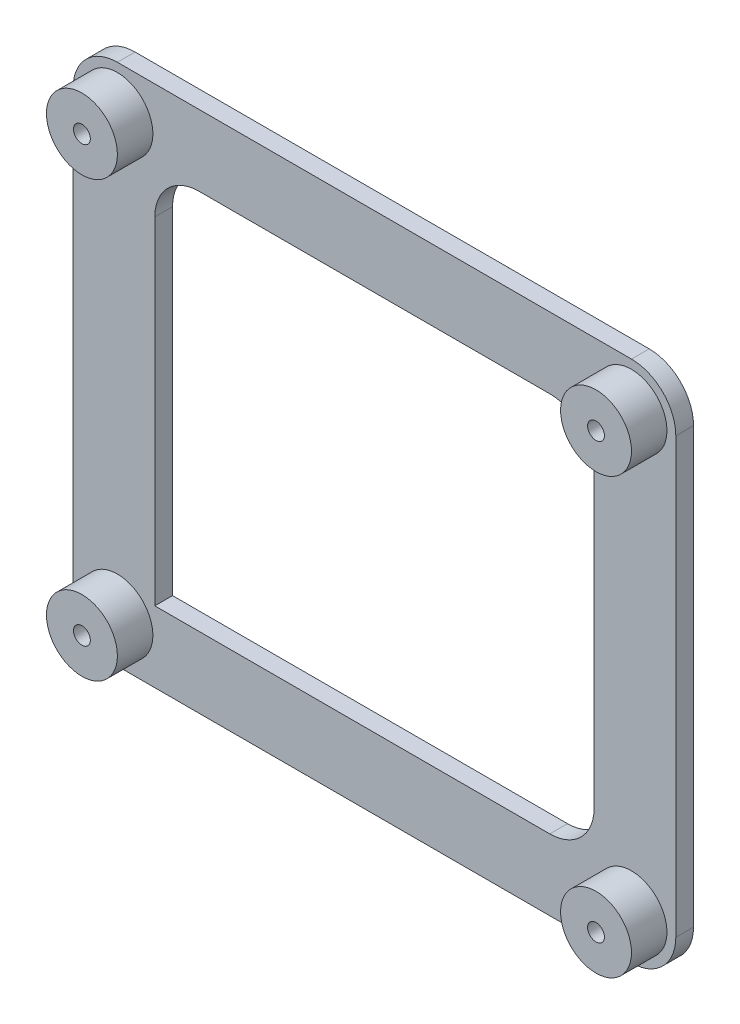
ISO-10303-21;
HEADER;
FILE_DESCRIPTION(('STEP AP214'),'2;1');
FILE_NAME('part.step','',(''),(''),'','','');
FILE_SCHEMA(('AUTOMOTIVE_DESIGN { 1 0 10303 214 1 1 1 1 }'));
ENDSEC;
DATA;
#1=APPLICATION_CONTEXT('core data for automotive mechanical design processes');
#2=APPLICATION_PROTOCOL_DEFINITION('international standard','automotive_design',2000,#1);
#3=PRODUCT_CONTEXT('',#1,'mechanical');
#4=PRODUCT('Part','Part','',(#3));
#5=PRODUCT_RELATED_PRODUCT_CATEGORY('part','',(#4));
#6=PRODUCT_DEFINITION_FORMATION('','',#4);
#7=PRODUCT_DEFINITION_CONTEXT('part definition',#1,'design');
#8=PRODUCT_DEFINITION('design','',#6,#7);
#9=PRODUCT_DEFINITION_SHAPE('','',#8);
#10=(LENGTH_UNIT() NAMED_UNIT(*) SI_UNIT(.MILLI.,.METRE.));
#11=(NAMED_UNIT(*) PLANE_ANGLE_UNIT() SI_UNIT($,.RADIAN.));
#12=(NAMED_UNIT(*) SI_UNIT($,.STERADIAN.) SOLID_ANGLE_UNIT());
#13=UNCERTAINTY_MEASURE_WITH_UNIT(LENGTH_MEASURE(1.E-05),#10,'distance_accuracy_value','');
#14=(GEOMETRIC_REPRESENTATION_CONTEXT(3) GLOBAL_UNCERTAINTY_ASSIGNED_CONTEXT((#13)) GLOBAL_UNIT_ASSIGNED_CONTEXT((#10,
#11,#12)) REPRESENTATION_CONTEXT('',''));
#15=CARTESIAN_POINT('',(0.,0.,0.));
#16=DIRECTION('',(0.,0.,1.));
#17=DIRECTION('',(1.,0.,0.));
#18=AXIS2_PLACEMENT_3D('',#15,#16,#17);
#19=CARTESIAN_POINT('',(0.,0.,2.));
#20=DIRECTION('',(0.,0.,-1.));
#21=DIRECTION('',(-1.,0.,0.));
#22=AXIS2_PLACEMENT_3D('',#19,#20,#21);
#23=PLANE('',#22);
#24=CARTESIAN_POINT('',(29.,-24.5,2.));
#25=DIRECTION('',(0.,0.,-1.));
#26=DIRECTION('',(-1.,0.,0.));
#27=AXIS2_PLACEMENT_3D('',#24,#25,#26);
#28=CIRCLE('',#27,4.);
#29=CARTESIAN_POINT('',(25.,-24.5,2.));
#30=VERTEX_POINT('',#29);
#31=EDGE_CURVE('E221',#30,#30,#28,.F.);
#32=ORIENTED_EDGE('',*,*,#31,.F.);
#33=EDGE_LOOP('',(#32));
#34=FACE_BOUND('',#33,.T.);
#35=CARTESIAN_POINT('',(-29.,24.5,2.));
#36=DIRECTION('',(0.,0.,-1.));
#37=DIRECTION('',(-1.,0.,0.));
#38=AXIS2_PLACEMENT_3D('',#35,#36,#37);
#39=CIRCLE('',#38,4.);
#40=CARTESIAN_POINT('',(-33.,24.5,2.));
#41=VERTEX_POINT('',#40);
#42=EDGE_CURVE('E200',#41,#41,#39,.F.);
#43=ORIENTED_EDGE('',*,*,#42,.F.);
#44=EDGE_LOOP('',(#43));
#45=FACE_BOUND('',#44,.T.);
#46=DIRECTION('',(-1.,0.,0.));
#47=VECTOR('',#46,1.);
#48=CARTESIAN_POINT('',(-34.,29.5,2.));
#49=LINE('',#48,#47);
#50=CARTESIAN_POINT('',(29.,29.5,2.));
#51=VERTEX_POINT('',#50);
#52=CARTESIAN_POINT('',(-29.,29.5,2.));
#53=VERTEX_POINT('',#52);
#54=EDGE_CURVE('E189',#51,#53,#49,.T.);
#55=ORIENTED_EDGE('',*,*,#54,.T.);
#56=CARTESIAN_POINT('',(-29.,24.5,2.));
#57=DIRECTION('',(0.,0.,-1.));
#58=DIRECTION('',(-1.,0.,0.));
#59=AXIS2_PLACEMENT_3D('',#56,#57,#58);
#60=CIRCLE('',#59,5.);
#61=CARTESIAN_POINT('',(-34.,24.5,2.));
#62=VERTEX_POINT('',#61);
#63=EDGE_CURVE('E282',#53,#62,#60,.F.);
#64=ORIENTED_EDGE('',*,*,#63,.T.);
#65=DIRECTION('',(0.,-1.,0.));
#66=VECTOR('',#65,1.);
#67=CARTESIAN_POINT('',(-34.,-29.5,2.));
#68=LINE('',#67,#66);
#69=CARTESIAN_POINT('',(-34.,-24.5,2.));
#70=VERTEX_POINT('',#69);
#71=EDGE_CURVE('E194',#62,#70,#68,.T.);
#72=ORIENTED_EDGE('',*,*,#71,.T.);
#73=CARTESIAN_POINT('',(-29.,-24.5,2.));
#74=DIRECTION('',(0.,0.,-1.));
#75=DIRECTION('',(-1.,0.,0.));
#76=AXIS2_PLACEMENT_3D('',#73,#74,#75);
#77=CIRCLE('',#76,5.);
#78=CARTESIAN_POINT('',(-29.,-29.5,2.));
#79=VERTEX_POINT('',#78);
#80=EDGE_CURVE('E62',#70,#79,#77,.F.);
#81=ORIENTED_EDGE('',*,*,#80,.T.);
#82=DIRECTION('',(1.,0.,0.));
#83=VECTOR('',#82,1.);
#84=CARTESIAN_POINT('',(-34.,-29.5,2.));
#85=LINE('',#84,#83);
#86=CARTESIAN_POINT('',(29.,-29.5,2.));
#87=VERTEX_POINT('',#86);
#88=EDGE_CURVE('E197',#79,#87,#85,.T.);
#89=ORIENTED_EDGE('',*,*,#88,.T.);
#90=CARTESIAN_POINT('',(29.,-24.5,2.));
#91=DIRECTION('',(0.,0.,-1.));
#92=DIRECTION('',(-1.,0.,0.));
#93=AXIS2_PLACEMENT_3D('',#90,#91,#92);
#94=CIRCLE('',#93,5.);
#95=CARTESIAN_POINT('',(34.,-24.5,2.));
#96=VERTEX_POINT('',#95);
#97=EDGE_CURVE('E276',#87,#96,#94,.F.);
#98=ORIENTED_EDGE('',*,*,#97,.T.);
#99=DIRECTION('',(0.,1.,0.));
#100=VECTOR('',#99,1.);
#101=CARTESIAN_POINT('',(34.,-29.5,2.));
#102=LINE('',#101,#100);
#103=CARTESIAN_POINT('',(34.,24.5,2.));
#104=VERTEX_POINT('',#103);
#105=EDGE_CURVE('E185',#96,#104,#102,.T.);
#106=ORIENTED_EDGE('',*,*,#105,.T.);
#107=CARTESIAN_POINT('',(29.,24.5,2.));
#108=DIRECTION('',(0.,0.,-1.));
#109=DIRECTION('',(-1.,0.,0.));
#110=AXIS2_PLACEMENT_3D('',#107,#108,#109);
#111=CIRCLE('',#110,5.);
#112=EDGE_CURVE('E279',#104,#51,#111,.F.);
#113=ORIENTED_EDGE('',*,*,#112,.T.);
#114=EDGE_LOOP('',(#55,#64,#72,#81,#89,#98,#106,#113));
#115=FACE_BOUND('',#114,.T.);
#116=DIRECTION('',(0.,1.,0.));
#117=VECTOR('',#116,1.);
#118=CARTESIAN_POINT('',(24.7796610169492,-21.5,2.));
#119=LINE('',#118,#117);
#120=CARTESIAN_POINT('',(24.7796610169492,-16.5,2.));
#121=VERTEX_POINT('',#120);
#122=CARTESIAN_POINT('',(24.7796610169492,16.5,2.));
#123=VERTEX_POINT('',#122);
#124=EDGE_CURVE('E177',#121,#123,#119,.T.);
#125=ORIENTED_EDGE('',*,*,#124,.F.);
#126=CARTESIAN_POINT('',(19.7796610169492,-16.5,2.));
#127=DIRECTION('',(0.,0.,-1.));
#128=DIRECTION('',(-1.,0.,0.));
#129=AXIS2_PLACEMENT_3D('',#126,#127,#128);
#130=CIRCLE('',#129,5.);
#131=CARTESIAN_POINT('',(19.7796610169492,-21.5,2.));
#132=VERTEX_POINT('',#131);
#133=EDGE_CURVE('E301',#121,#132,#130,.T.);
#134=ORIENTED_EDGE('',*,*,#133,.T.);
#135=DIRECTION('',(1.,0.,0.));
#136=VECTOR('',#135,1.);
#137=CARTESIAN_POINT('',(-24.7796610169492,-21.5,2.));
#138=LINE('',#137,#136);
#139=CARTESIAN_POINT('',(-24.7796610169492,-21.5,2.));
#140=VERTEX_POINT('',#139);
#141=EDGE_CURVE('E170',#140,#132,#138,.T.);
#142=ORIENTED_EDGE('',*,*,#141,.F.);
#143=DIRECTION('',(0.,-1.,0.));
#144=VECTOR('',#143,1.);
#145=CARTESIAN_POINT('',(-24.7796610169492,-21.5,2.));
#146=LINE('',#145,#144);
#147=CARTESIAN_POINT('',(-24.7796610169492,16.5,2.));
#148=VERTEX_POINT('',#147);
#149=EDGE_CURVE('E164',#148,#140,#146,.T.);
#150=ORIENTED_EDGE('',*,*,#149,.F.);
#151=CARTESIAN_POINT('',(-19.7796610169492,16.5,2.));
#152=DIRECTION('',(0.,0.,-1.));
#153=DIRECTION('',(-1.,0.,0.));
#154=AXIS2_PLACEMENT_3D('',#151,#152,#153);
#155=CIRCLE('',#154,5.);
#156=CARTESIAN_POINT('',(-19.7796610169492,21.5,2.));
#157=VERTEX_POINT('',#156);
#158=EDGE_CURVE('E11',#148,#157,#155,.T.);
#159=ORIENTED_EDGE('',*,*,#158,.T.);
#160=DIRECTION('',(-1.,0.,0.));
#161=VECTOR('',#160,1.);
#162=CARTESIAN_POINT('',(-24.7796610169492,21.5,2.));
#163=LINE('',#162,#161);
#164=CARTESIAN_POINT('',(19.7796610169492,21.5,2.));
#165=VERTEX_POINT('',#164);
#166=EDGE_CURVE('E181',#165,#157,#163,.T.);
#167=ORIENTED_EDGE('',*,*,#166,.F.);
#168=CARTESIAN_POINT('',(19.7796610169492,16.5,2.));
#169=DIRECTION('',(0.,0.,-1.));
#170=DIRECTION('',(-1.,0.,0.));
#171=AXIS2_PLACEMENT_3D('',#168,#169,#170);
#172=CIRCLE('',#171,5.);
#173=EDGE_CURVE('E307',#165,#123,#172,.T.);
#174=ORIENTED_EDGE('',*,*,#173,.T.);
#175=EDGE_LOOP('',(#125,#134,#142,#150,#159,#167,#174));
#176=FACE_BOUND('',#175,.T.);
#177=CARTESIAN_POINT('',(29.,24.5,2.));
#178=DIRECTION('',(0.,0.,-1.));
#179=DIRECTION('',(-1.,0.,0.));
#180=AXIS2_PLACEMENT_3D('',#177,#178,#179);
#181=CIRCLE('',#180,4.);
#182=CARTESIAN_POINT('',(25.,24.5,2.));
#183=VERTEX_POINT('',#182);
#184=EDGE_CURVE('E217',#183,#183,#181,.F.);
#185=ORIENTED_EDGE('',*,*,#184,.F.);
#186=EDGE_LOOP('',(#185));
#187=FACE_BOUND('',#186,.T.);
#188=CARTESIAN_POINT('',(-29.,-24.5,2.));
#189=DIRECTION('',(0.,0.,-1.));
#190=DIRECTION('',(-1.,0.,0.));
#191=AXIS2_PLACEMENT_3D('',#188,#189,#190);
#192=CIRCLE('',#191,4.);
#193=CARTESIAN_POINT('',(-33.,-24.5,2.));
#194=VERTEX_POINT('',#193);
#195=EDGE_CURVE('E225',#194,#194,#192,.F.);
#196=ORIENTED_EDGE('',*,*,#195,.F.);
#197=EDGE_LOOP('',(#196));
#198=FACE_BOUND('',#197,.T.);
#199=ADVANCED_FACE('F39',(#34,#45,#115,#176,#187,#198),#23,.F.);
#200=CARTESIAN_POINT('',(0.,0.,0.));
#201=DIRECTION('',(0.,0.,-1.));
#202=DIRECTION('',(-1.,0.,0.));
#203=AXIS2_PLACEMENT_3D('',#200,#201,#202);
#204=PLANE('',#203);
#205=CARTESIAN_POINT('',(29.,-24.5,0.));
#206=DIRECTION('',(0.,0.,1.));
#207=DIRECTION('',(1.,0.,0.));
#208=AXIS2_PLACEMENT_3D('',#205,#206,#207);
#209=CIRCLE('',#208,0.950000000000001);
#210=CARTESIAN_POINT('',(29.95,-24.5,0.));
#211=VERTEX_POINT('',#210);
#212=EDGE_CURVE('E675',#211,#211,#209,.T.);
#213=ORIENTED_EDGE('',*,*,#212,.T.);
#214=EDGE_LOOP('',(#213));
#215=FACE_BOUND('',#214,.T.);
#216=CARTESIAN_POINT('',(-29.,24.5,0.));
#217=DIRECTION('',(0.,0.,1.));
#218=DIRECTION('',(1.,0.,0.));
#219=AXIS2_PLACEMENT_3D('',#216,#217,#218);
#220=CIRCLE('',#219,0.950000000000001);
#221=CARTESIAN_POINT('',(-28.05,24.5,0.));
#222=VERTEX_POINT('',#221);
#223=EDGE_CURVE('E325',#222,#222,#220,.T.);
#224=ORIENTED_EDGE('',*,*,#223,.T.);
#225=EDGE_LOOP('',(#224));
#226=FACE_BOUND('',#225,.T.);
#227=DIRECTION('',(0.,-1.,0.));
#228=VECTOR('',#227,1.);
#229=CARTESIAN_POINT('',(-34.,-29.5,0.));
#230=LINE('',#229,#228);
#231=CARTESIAN_POINT('',(-34.,24.5,0.));
#232=VERTEX_POINT('',#231);
#233=CARTESIAN_POINT('',(-34.,-24.5,0.));
#234=VERTEX_POINT('',#233);
#235=EDGE_CURVE('E208',#232,#234,#230,.T.);
#236=ORIENTED_EDGE('',*,*,#235,.F.);
#237=CARTESIAN_POINT('',(-29.,24.5,0.));
#238=DIRECTION('',(0.,0.,-1.));
#239=DIRECTION('',(-1.,0.,0.));
#240=AXIS2_PLACEMENT_3D('',#237,#238,#239);
#241=CIRCLE('',#240,5.);
#242=CARTESIAN_POINT('',(-29.,29.5,0.));
#243=VERTEX_POINT('',#242);
#244=EDGE_CURVE('E264',#232,#243,#241,.T.);
#245=ORIENTED_EDGE('',*,*,#244,.T.);
#246=DIRECTION('',(-1.,0.,0.));
#247=VECTOR('',#246,1.);
#248=CARTESIAN_POINT('',(-34.,29.5,0.));
#249=LINE('',#248,#247);
#250=CARTESIAN_POINT('',(29.,29.5,0.));
#251=VERTEX_POINT('',#250);
#252=EDGE_CURVE('E204',#251,#243,#249,.T.);
#253=ORIENTED_EDGE('',*,*,#252,.F.);
#254=CARTESIAN_POINT('',(29.,24.5,0.));
#255=DIRECTION('',(0.,0.,-1.));
#256=DIRECTION('',(-1.,0.,0.));
#257=AXIS2_PLACEMENT_3D('',#254,#255,#256);
#258=CIRCLE('',#257,5.);
#259=CARTESIAN_POINT('',(34.,24.5,0.));
#260=VERTEX_POINT('',#259);
#261=EDGE_CURVE('E261',#251,#260,#258,.T.);
#262=ORIENTED_EDGE('',*,*,#261,.T.);
#263=DIRECTION('',(0.,1.,0.));
#264=VECTOR('',#263,1.);
#265=CARTESIAN_POINT('',(34.,-29.5,0.));
#266=LINE('',#265,#264);
#267=CARTESIAN_POINT('',(34.,-24.5,0.));
#268=VERTEX_POINT('',#267);
#269=EDGE_CURVE('E169',#268,#260,#266,.T.);
#270=ORIENTED_EDGE('',*,*,#269,.F.);
#271=CARTESIAN_POINT('',(29.,-24.5,0.));
#272=DIRECTION('',(0.,0.,-1.));
#273=DIRECTION('',(-1.,0.,0.));
#274=AXIS2_PLACEMENT_3D('',#271,#272,#273);
#275=CIRCLE('',#274,5.);
#276=CARTESIAN_POINT('',(29.,-29.5,0.));
#277=VERTEX_POINT('',#276);
#278=EDGE_CURVE('E258',#268,#277,#275,.T.);
#279=ORIENTED_EDGE('',*,*,#278,.T.);
#280=DIRECTION('',(1.,0.,0.));
#281=VECTOR('',#280,1.);
#282=CARTESIAN_POINT('',(-34.,-29.5,0.));
#283=LINE('',#282,#281);
#284=CARTESIAN_POINT('',(-29.,-29.5,0.));
#285=VERTEX_POINT('',#284);
#286=EDGE_CURVE('E190',#285,#277,#283,.T.);
#287=ORIENTED_EDGE('',*,*,#286,.F.);
#288=CARTESIAN_POINT('',(-29.,-24.5,0.));
#289=DIRECTION('',(0.,0.,-1.));
#290=DIRECTION('',(-1.,0.,0.));
#291=AXIS2_PLACEMENT_3D('',#288,#289,#290);
#292=CIRCLE('',#291,5.);
#293=EDGE_CURVE('E255',#285,#234,#292,.T.);
#294=ORIENTED_EDGE('',*,*,#293,.T.);
#295=EDGE_LOOP('',(#236,#245,#253,#262,#270,#279,#287,#294));
#296=FACE_BOUND('',#295,.T.);
#297=DIRECTION('',(1.,0.,0.));
#298=VECTOR('',#297,1.);
#299=CARTESIAN_POINT('',(-24.7796610169492,-21.5,0.));
#300=LINE('',#299,#298);
#301=CARTESIAN_POINT('',(-24.7796610169492,-21.5,0.));
#302=VERTEX_POINT('',#301);
#303=CARTESIAN_POINT('',(19.7796610169492,-21.5,0.));
#304=VERTEX_POINT('',#303);
#305=EDGE_CURVE('E153',#302,#304,#300,.T.);
#306=ORIENTED_EDGE('',*,*,#305,.T.);
#307=CARTESIAN_POINT('',(19.7796610169492,-16.5,0.));
#308=DIRECTION('',(0.,0.,-1.));
#309=DIRECTION('',(-1.,0.,0.));
#310=AXIS2_PLACEMENT_3D('',#307,#308,#309);
#311=CIRCLE('',#310,5.);
#312=CARTESIAN_POINT('',(24.7796610169492,-16.5,0.));
#313=VERTEX_POINT('',#312);
#314=EDGE_CURVE('E298',#304,#313,#311,.F.);
#315=ORIENTED_EDGE('',*,*,#314,.T.);
#316=DIRECTION('',(0.,1.,0.));
#317=VECTOR('',#316,1.);
#318=CARTESIAN_POINT('',(24.7796610169492,-21.5,0.));
#319=LINE('',#318,#317);
#320=CARTESIAN_POINT('',(24.7796610169492,16.5,0.));
#321=VERTEX_POINT('',#320);
#322=EDGE_CURVE('E322',#313,#321,#319,.T.);
#323=ORIENTED_EDGE('',*,*,#322,.T.);
#324=CARTESIAN_POINT('',(19.7796610169492,16.5,0.));
#325=DIRECTION('',(0.,0.,-1.));
#326=DIRECTION('',(-1.,0.,0.));
#327=AXIS2_PLACEMENT_3D('',#324,#325,#326);
#328=CIRCLE('',#327,5.);
#329=CARTESIAN_POINT('',(19.7796610169492,21.5,0.));
#330=VERTEX_POINT('',#329);
#331=EDGE_CURVE('E304',#321,#330,#328,.F.);
#332=ORIENTED_EDGE('',*,*,#331,.T.);
#333=DIRECTION('',(-1.,0.,0.));
#334=VECTOR('',#333,1.);
#335=CARTESIAN_POINT('',(-24.7796610169492,21.5,0.));
#336=LINE('',#335,#334);
#337=CARTESIAN_POINT('',(-19.7796610169492,21.5,0.));
#338=VERTEX_POINT('',#337);
#339=EDGE_CURVE('E158',#330,#338,#336,.T.);
#340=ORIENTED_EDGE('',*,*,#339,.T.);
#341=CARTESIAN_POINT('',(-19.7796610169492,16.5,0.));
#342=DIRECTION('',(0.,0.,-1.));
#343=DIRECTION('',(-1.,0.,0.));
#344=AXIS2_PLACEMENT_3D('',#341,#342,#343);
#345=CIRCLE('',#344,5.);
#346=CARTESIAN_POINT('',(-24.7796610169492,16.5,0.));
#347=VERTEX_POINT('',#346);
#348=EDGE_CURVE('E48',#338,#347,#345,.F.);
#349=ORIENTED_EDGE('',*,*,#348,.T.);
#350=DIRECTION('',(0.,-1.,0.));
#351=VECTOR('',#350,1.);
#352=CARTESIAN_POINT('',(-24.7796610169492,-21.5,0.));
#353=LINE('',#352,#351);
#354=EDGE_CURVE('E148',#347,#302,#353,.T.);
#355=ORIENTED_EDGE('',*,*,#354,.T.);
#356=EDGE_LOOP('',(#306,#315,#323,#332,#340,#349,#355));
#357=FACE_BOUND('',#356,.T.);
#358=CARTESIAN_POINT('',(29.,24.5,0.));
#359=DIRECTION('',(0.,0.,1.));
#360=DIRECTION('',(1.,0.,0.));
#361=AXIS2_PLACEMENT_3D('',#358,#359,#360);
#362=CIRCLE('',#361,0.950000000000001);
#363=CARTESIAN_POINT('',(29.95,24.5,0.));
#364=VERTEX_POINT('',#363);
#365=EDGE_CURVE('E679',#364,#364,#362,.T.);
#366=ORIENTED_EDGE('',*,*,#365,.T.);
#367=EDGE_LOOP('',(#366));
#368=FACE_BOUND('',#367,.T.);
#369=CARTESIAN_POINT('',(-29.,-24.5,0.));
#370=DIRECTION('',(0.,0.,1.));
#371=DIRECTION('',(1.,0.,0.));
#372=AXIS2_PLACEMENT_3D('',#369,#370,#371);
#373=CIRCLE('',#372,0.950000000000001);
#374=CARTESIAN_POINT('',(-28.05,-24.5,0.));
#375=VERTEX_POINT('',#374);
#376=EDGE_CURVE('E665',#375,#375,#373,.T.);
#377=ORIENTED_EDGE('',*,*,#376,.T.);
#378=EDGE_LOOP('',(#377));
#379=FACE_BOUND('',#378,.T.);
#380=ADVANCED_FACE('F150',(#215,#226,#296,#357,#368,#379),#204,.T.);
#381=CARTESIAN_POINT('',(34.,-29.5,2.));
#382=DIRECTION('',(-1.,0.,0.));
#383=DIRECTION('',(0.,0.,1.));
#384=AXIS2_PLACEMENT_3D('',#381,#382,#383);
#385=PLANE('',#384);
#386=ORIENTED_EDGE('',*,*,#269,.T.);
#387=DIRECTION('',(0.,0.,-1.));
#388=VECTOR('',#387,1.);
#389=CARTESIAN_POINT('',(34.,24.5,2.));
#390=LINE('',#389,#388);
#391=EDGE_CURVE('E289',#260,#104,#390,.F.);
#392=ORIENTED_EDGE('',*,*,#391,.T.);
#393=ORIENTED_EDGE('',*,*,#105,.F.);
#394=DIRECTION('',(0.,0.,-1.));
#395=VECTOR('',#394,1.);
#396=CARTESIAN_POINT('',(34.,-24.5,2.));
#397=LINE('',#396,#395);
#398=EDGE_CURVE('E285',#96,#268,#397,.T.);
#399=ORIENTED_EDGE('',*,*,#398,.T.);
#400=EDGE_LOOP('',(#386,#392,#393,#399));
#401=FACE_BOUND('',#400,.T.);
#402=ADVANCED_FACE('F364',(#401),#385,.F.);
#403=CARTESIAN_POINT('',(-34.,29.5,2.));
#404=DIRECTION('',(0.,-1.,0.));
#405=DIRECTION('',(0.,0.,-1.));
#406=AXIS2_PLACEMENT_3D('',#403,#404,#405);
#407=PLANE('',#406);
#408=ORIENTED_EDGE('',*,*,#252,.T.);
#409=DIRECTION('',(0.,0.,-1.));
#410=VECTOR('',#409,1.);
#411=CARTESIAN_POINT('',(-29.,29.5,2.));
#412=LINE('',#411,#410);
#413=EDGE_CURVE('E271',#243,#53,#412,.F.);
#414=ORIENTED_EDGE('',*,*,#413,.T.);
#415=ORIENTED_EDGE('',*,*,#54,.F.);
#416=DIRECTION('',(0.,0.,-1.));
#417=VECTOR('',#416,1.);
#418=CARTESIAN_POINT('',(29.,29.5,2.));
#419=LINE('',#418,#417);
#420=EDGE_CURVE('E267',#51,#251,#419,.T.);
#421=ORIENTED_EDGE('',*,*,#420,.T.);
#422=EDGE_LOOP('',(#408,#414,#415,#421));
#423=FACE_BOUND('',#422,.T.);
#424=ADVANCED_FACE('F378',(#423),#407,.F.);
#425=CARTESIAN_POINT('',(-34.,-29.5,2.));
#426=DIRECTION('',(1.,0.,0.));
#427=DIRECTION('',(0.,0.,-1.));
#428=AXIS2_PLACEMENT_3D('',#425,#426,#427);
#429=PLANE('',#428);
#430=ORIENTED_EDGE('',*,*,#71,.F.);
#431=DIRECTION('',(0.,0.,-1.));
#432=VECTOR('',#431,1.);
#433=CARTESIAN_POINT('',(-34.,24.5,2.));
#434=LINE('',#433,#432);
#435=EDGE_CURVE('E251',#62,#232,#434,.T.);
#436=ORIENTED_EDGE('',*,*,#435,.T.);
#437=ORIENTED_EDGE('',*,*,#235,.T.);
#438=DIRECTION('',(0.,0.,-1.));
#439=VECTOR('',#438,1.);
#440=CARTESIAN_POINT('',(-34.,-24.5,2.));
#441=LINE('',#440,#439);
#442=EDGE_CURVE('E248',#234,#70,#441,.F.);
#443=ORIENTED_EDGE('',*,*,#442,.T.);
#444=EDGE_LOOP('',(#430,#436,#437,#443));
#445=FACE_BOUND('',#444,.T.);
#446=ADVANCED_FACE('F375',(#445),#429,.F.);
#447=CARTESIAN_POINT('',(-34.,-29.5,2.));
#448=DIRECTION('',(0.,1.,0.));
#449=DIRECTION('',(0.,0.,1.));
#450=AXIS2_PLACEMENT_3D('',#447,#448,#449);
#451=PLANE('',#450);
#452=ORIENTED_EDGE('',*,*,#286,.T.);
#453=DIRECTION('',(0.,0.,-1.));
#454=VECTOR('',#453,1.);
#455=CARTESIAN_POINT('',(29.,-29.5,2.));
#456=LINE('',#455,#454);
#457=EDGE_CURVE('E55',#277,#87,#456,.F.);
#458=ORIENTED_EDGE('',*,*,#457,.T.);
#459=ORIENTED_EDGE('',*,*,#88,.F.);
#460=DIRECTION('',(0.,0.,-1.));
#461=VECTOR('',#460,1.);
#462=CARTESIAN_POINT('',(-29.,-29.5,2.));
#463=LINE('',#462,#461);
#464=EDGE_CURVE('E292',#79,#285,#463,.T.);
#465=ORIENTED_EDGE('',*,*,#464,.T.);
#466=EDGE_LOOP('',(#452,#458,#459,#465));
#467=FACE_BOUND('',#466,.T.);
#468=ADVANCED_FACE('F372',(#467),#451,.F.);
#469=CARTESIAN_POINT('',(24.7796610169492,-21.5,2.));
#470=DIRECTION('',(-1.,0.,0.));
#471=DIRECTION('',(0.,0.,1.));
#472=AXIS2_PLACEMENT_3D('',#469,#470,#471);
#473=PLANE('',#472);
#474=ORIENTED_EDGE('',*,*,#322,.F.);
#475=DIRECTION('',(0.,0.,-1.));
#476=VECTOR('',#475,1.);
#477=CARTESIAN_POINT('',(24.7796610169492,-16.5,2.));
#478=LINE('',#477,#476);
#479=EDGE_CURVE('E235',#313,#121,#478,.F.);
#480=ORIENTED_EDGE('',*,*,#479,.T.);
#481=ORIENTED_EDGE('',*,*,#124,.T.);
#482=DIRECTION('',(0.,0.,-1.));
#483=VECTOR('',#482,1.);
#484=CARTESIAN_POINT('',(24.7796610169492,16.5,0.));
#485=LINE('',#484,#483);
#486=EDGE_CURVE('E231',#123,#321,#485,.T.);
#487=ORIENTED_EDGE('',*,*,#486,.T.);
#488=EDGE_LOOP('',(#474,#480,#481,#487));
#489=FACE_BOUND('',#488,.T.);
#490=ADVANCED_FACE('F340',(#489),#473,.T.);
#491=CARTESIAN_POINT('',(-24.7796610169492,21.5,2.));
#492=DIRECTION('',(0.,-1.,0.));
#493=DIRECTION('',(0.,0.,-1.));
#494=AXIS2_PLACEMENT_3D('',#491,#492,#493);
#495=PLANE('',#494);
#496=ORIENTED_EDGE('',*,*,#339,.F.);
#497=DIRECTION('',(0.,0.,-1.));
#498=VECTOR('',#497,1.);
#499=CARTESIAN_POINT('',(19.7796610169492,21.5,2.));
#500=LINE('',#499,#498);
#501=EDGE_CURVE('E242',#330,#165,#500,.F.);
#502=ORIENTED_EDGE('',*,*,#501,.T.);
#503=ORIENTED_EDGE('',*,*,#166,.T.);
#504=DIRECTION('',(0.,0.,-1.));
#505=VECTOR('',#504,1.);
#506=CARTESIAN_POINT('',(-19.7796610169492,21.5,0.));
#507=LINE('',#506,#505);
#508=EDGE_CURVE('E238',#157,#338,#507,.T.);
#509=ORIENTED_EDGE('',*,*,#508,.T.);
#510=EDGE_LOOP('',(#496,#502,#503,#509));
#511=FACE_BOUND('',#510,.T.);
#512=ADVANCED_FACE('F329',(#511),#495,.T.);
#513=CARTESIAN_POINT('',(-24.7796610169492,-21.5,2.));
#514=DIRECTION('',(1.,0.,0.));
#515=DIRECTION('',(0.,0.,-1.));
#516=AXIS2_PLACEMENT_3D('',#513,#514,#515);
#517=PLANE('',#516);
#518=ORIENTED_EDGE('',*,*,#354,.F.);
#519=DIRECTION('',(0.,0.,-1.));
#520=VECTOR('',#519,1.);
#521=CARTESIAN_POINT('',(-24.7796610169492,16.5,2.));
#522=LINE('',#521,#520);
#523=EDGE_CURVE('E245',#347,#148,#522,.F.);
#524=ORIENTED_EDGE('',*,*,#523,.T.);
#525=ORIENTED_EDGE('',*,*,#149,.T.);
#526=DIRECTION('',(0.,0.,-1.));
#527=VECTOR('',#526,1.);
#528=CARTESIAN_POINT('',(-24.7796610169492,-21.5,2.));
#529=LINE('',#528,#527);
#530=EDGE_CURVE('E161',#140,#302,#529,.T.);
#531=ORIENTED_EDGE('',*,*,#530,.T.);
#532=EDGE_LOOP('',(#518,#524,#525,#531));
#533=FACE_BOUND('',#532,.T.);
#534=ADVANCED_FACE('F162',(#533),#517,.T.);
#535=CARTESIAN_POINT('',(-24.7796610169492,-21.5,2.));
#536=DIRECTION('',(0.,1.,0.));
#537=DIRECTION('',(0.,0.,1.));
#538=AXIS2_PLACEMENT_3D('',#535,#536,#537);
#539=PLANE('',#538);
#540=ORIENTED_EDGE('',*,*,#141,.T.);
#541=DIRECTION('',(0.,0.,-1.));
#542=VECTOR('',#541,1.);
#543=CARTESIAN_POINT('',(19.7796610169492,-21.5,0.));
#544=LINE('',#543,#542);
#545=EDGE_CURVE('E175',#132,#304,#544,.T.);
#546=ORIENTED_EDGE('',*,*,#545,.T.);
#547=ORIENTED_EDGE('',*,*,#305,.F.);
#548=ORIENTED_EDGE('',*,*,#530,.F.);
#549=EDGE_LOOP('',(#540,#546,#547,#548));
#550=FACE_BOUND('',#549,.T.);
#551=ADVANCED_FACE('F173',(#550),#539,.T.);
#552=CARTESIAN_POINT('',(-29.,24.5,2.));
#553=DIRECTION('',(0.,0.,-1.));
#554=DIRECTION('',(-1.,0.,0.));
#555=AXIS2_PLACEMENT_3D('',#552,#553,#554);
#556=CYLINDRICAL_SURFACE('',#555,0.950000000000001);
#557=ORIENTED_EDGE('',*,*,#223,.F.);
#558=EDGE_LOOP('',(#557));
#559=FACE_BOUND('',#558,.T.);
#560=CARTESIAN_POINT('',(-29.,24.5,6.));
#561=DIRECTION('',(0.,0.,1.));
#562=DIRECTION('',(1.,0.,0.));
#563=AXIS2_PLACEMENT_3D('',#560,#561,#562);
#564=CIRCLE('',#563,0.950000000000001);
#565=CARTESIAN_POINT('',(-28.05,24.5,6.));
#566=VERTEX_POINT('',#565);
#567=EDGE_CURVE('E656',#566,#566,#564,.T.);
#568=ORIENTED_EDGE('',*,*,#567,.T.);
#569=EDGE_LOOP('',(#568));
#570=FACE_BOUND('',#569,.T.);
#571=ADVANCED_FACE('F437',(#559,#570),#556,.F.);
#572=CARTESIAN_POINT('',(29.,24.5,2.));
#573=DIRECTION('',(0.,0.,-1.));
#574=DIRECTION('',(-1.,0.,0.));
#575=AXIS2_PLACEMENT_3D('',#572,#573,#574);
#576=CYLINDRICAL_SURFACE('',#575,0.950000000000001);
#577=ORIENTED_EDGE('',*,*,#365,.F.);
#578=EDGE_LOOP('',(#577));
#579=FACE_BOUND('',#578,.T.);
#580=CARTESIAN_POINT('',(29.,24.5,6.));
#581=DIRECTION('',(0.,0.,1.));
#582=DIRECTION('',(1.,0.,0.));
#583=AXIS2_PLACEMENT_3D('',#580,#581,#582);
#584=CIRCLE('',#583,0.950000000000001);
#585=CARTESIAN_POINT('',(29.95,24.5,6.));
#586=VERTEX_POINT('',#585);
#587=EDGE_CURVE('E668',#586,#586,#584,.T.);
#588=ORIENTED_EDGE('',*,*,#587,.T.);
#589=EDGE_LOOP('',(#588));
#590=FACE_BOUND('',#589,.T.);
#591=ADVANCED_FACE('F433',(#579,#590),#576,.F.);
#592=CARTESIAN_POINT('',(29.,-24.5,2.));
#593=DIRECTION('',(0.,0.,-1.));
#594=DIRECTION('',(-1.,0.,0.));
#595=AXIS2_PLACEMENT_3D('',#592,#593,#594);
#596=CYLINDRICAL_SURFACE('',#595,0.950000000000001);
#597=ORIENTED_EDGE('',*,*,#212,.F.);
#598=EDGE_LOOP('',(#597));
#599=FACE_BOUND('',#598,.T.);
#600=CARTESIAN_POINT('',(29.,-24.5,6.));
#601=DIRECTION('',(0.,0.,1.));
#602=DIRECTION('',(1.,0.,0.));
#603=AXIS2_PLACEMENT_3D('',#600,#601,#602);
#604=CIRCLE('',#603,0.950000000000001);
#605=CARTESIAN_POINT('',(29.95,-24.5,6.));
#606=VERTEX_POINT('',#605);
#607=EDGE_CURVE('E694',#606,#606,#604,.T.);
#608=ORIENTED_EDGE('',*,*,#607,.T.);
#609=EDGE_LOOP('',(#608));
#610=FACE_BOUND('',#609,.T.);
#611=ADVANCED_FACE('F429',(#599,#610),#596,.F.);
#612=CARTESIAN_POINT('',(-29.,-24.5,2.));
#613=DIRECTION('',(0.,0.,-1.));
#614=DIRECTION('',(-1.,0.,0.));
#615=AXIS2_PLACEMENT_3D('',#612,#613,#614);
#616=CYLINDRICAL_SURFACE('',#615,0.950000000000001);
#617=ORIENTED_EDGE('',*,*,#376,.F.);
#618=EDGE_LOOP('',(#617));
#619=FACE_BOUND('',#618,.T.);
#620=CARTESIAN_POINT('',(-29.,-24.5,6.));
#621=DIRECTION('',(0.,0.,1.));
#622=DIRECTION('',(1.,0.,0.));
#623=AXIS2_PLACEMENT_3D('',#620,#621,#622);
#624=CIRCLE('',#623,0.950000000000001);
#625=CARTESIAN_POINT('',(-28.05,-24.5,6.));
#626=VERTEX_POINT('',#625);
#627=EDGE_CURVE('E704',#626,#626,#624,.T.);
#628=ORIENTED_EDGE('',*,*,#627,.T.);
#629=EDGE_LOOP('',(#628));
#630=FACE_BOUND('',#629,.T.);
#631=ADVANCED_FACE('F422',(#619,#630),#616,.F.);
#632=CARTESIAN_POINT('',(-29.,24.5,6.));
#633=DIRECTION('',(0.,0.,1.));
#634=DIRECTION('',(1.,0.,0.));
#635=AXIS2_PLACEMENT_3D('',#632,#633,#634);
#636=PLANE('',#635);
#637=CARTESIAN_POINT('',(-29.,24.5,6.));
#638=DIRECTION('',(0.,0.,1.));
#639=DIRECTION('',(1.,0.,0.));
#640=AXIS2_PLACEMENT_3D('',#637,#638,#639);
#641=CIRCLE('',#640,4.);
#642=CARTESIAN_POINT('',(-25.,24.5,6.));
#643=VERTEX_POINT('',#642);
#644=EDGE_CURVE('E659',#643,#643,#641,.T.);
#645=ORIENTED_EDGE('',*,*,#644,.T.);
#646=EDGE_LOOP('',(#645));
#647=FACE_BOUND('',#646,.T.);
#648=ORIENTED_EDGE('',*,*,#567,.F.);
#649=EDGE_LOOP('',(#648));
#650=FACE_BOUND('',#649,.T.);
#651=ADVANCED_FACE('F419',(#647,#650),#636,.T.);
#652=CARTESIAN_POINT('',(-29.,24.5,6.));
#653=DIRECTION('',(0.,0.,-1.));
#654=DIRECTION('',(-1.,0.,0.));
#655=AXIS2_PLACEMENT_3D('',#652,#653,#654);
#656=CYLINDRICAL_SURFACE('',#655,4.);
#657=ORIENTED_EDGE('',*,*,#644,.F.);
#658=EDGE_LOOP('',(#657));
#659=FACE_BOUND('',#658,.T.);
#660=ORIENTED_EDGE('',*,*,#42,.T.);
#661=EDGE_LOOP('',(#660));
#662=FACE_BOUND('',#661,.T.);
#663=ADVANCED_FACE('F414',(#659,#662),#656,.T.);
#664=CARTESIAN_POINT('',(29.,24.5,6.));
#665=DIRECTION('',(0.,0.,1.));
#666=DIRECTION('',(1.,0.,0.));
#667=AXIS2_PLACEMENT_3D('',#664,#665,#666);
#668=PLANE('',#667);
#669=CARTESIAN_POINT('',(29.,24.5,6.));
#670=DIRECTION('',(0.,0.,1.));
#671=DIRECTION('',(1.,0.,0.));
#672=AXIS2_PLACEMENT_3D('',#669,#670,#671);
#673=CIRCLE('',#672,4.);
#674=CARTESIAN_POINT('',(33.,24.5,6.));
#675=VERTEX_POINT('',#674);
#676=EDGE_CURVE('E660',#675,#675,#673,.T.);
#677=ORIENTED_EDGE('',*,*,#676,.T.);
#678=EDGE_LOOP('',(#677));
#679=FACE_BOUND('',#678,.T.);
#680=ORIENTED_EDGE('',*,*,#587,.F.);
#681=EDGE_LOOP('',(#680));
#682=FACE_BOUND('',#681,.T.);
#683=ADVANCED_FACE('F411',(#679,#682),#668,.T.);
#684=CARTESIAN_POINT('',(29.,24.5,6.));
#685=DIRECTION('',(0.,0.,-1.));
#686=DIRECTION('',(-1.,0.,0.));
#687=AXIS2_PLACEMENT_3D('',#684,#685,#686);
#688=CYLINDRICAL_SURFACE('',#687,4.);
#689=ORIENTED_EDGE('',*,*,#676,.F.);
#690=EDGE_LOOP('',(#689));
#691=FACE_BOUND('',#690,.T.);
#692=ORIENTED_EDGE('',*,*,#184,.T.);
#693=EDGE_LOOP('',(#692));
#694=FACE_BOUND('',#693,.T.);
#695=ADVANCED_FACE('F406',(#691,#694),#688,.T.);
#696=CARTESIAN_POINT('',(29.,-24.5,6.));
#697=DIRECTION('',(0.,0.,1.));
#698=DIRECTION('',(1.,0.,0.));
#699=AXIS2_PLACEMENT_3D('',#696,#697,#698);
#700=PLANE('',#699);
#701=CARTESIAN_POINT('',(29.,-24.5,6.));
#702=DIRECTION('',(0.,0.,1.));
#703=DIRECTION('',(1.,0.,0.));
#704=AXIS2_PLACEMENT_3D('',#701,#702,#703);
#705=CIRCLE('',#704,4.);
#706=CARTESIAN_POINT('',(33.,-24.5,6.));
#707=VERTEX_POINT('',#706);
#708=EDGE_CURVE('E691',#707,#707,#705,.T.);
#709=ORIENTED_EDGE('',*,*,#708,.T.);
#710=EDGE_LOOP('',(#709));
#711=FACE_BOUND('',#710,.T.);
#712=ORIENTED_EDGE('',*,*,#607,.F.);
#713=EDGE_LOOP('',(#712));
#714=FACE_BOUND('',#713,.T.);
#715=ADVANCED_FACE('F403',(#711,#714),#700,.T.);
#716=CARTESIAN_POINT('',(29.,-24.5,6.));
#717=DIRECTION('',(0.,0.,-1.));
#718=DIRECTION('',(-1.,0.,0.));
#719=AXIS2_PLACEMENT_3D('',#716,#717,#718);
#720=CYLINDRICAL_SURFACE('',#719,4.);
#721=ORIENTED_EDGE('',*,*,#708,.F.);
#722=EDGE_LOOP('',(#721));
#723=FACE_BOUND('',#722,.T.);
#724=ORIENTED_EDGE('',*,*,#31,.T.);
#725=EDGE_LOOP('',(#724));
#726=FACE_BOUND('',#725,.T.);
#727=ADVANCED_FACE('F397',(#723,#726),#720,.T.);
#728=CARTESIAN_POINT('',(-29.,-24.5,6.));
#729=DIRECTION('',(0.,0.,1.));
#730=DIRECTION('',(1.,0.,0.));
#731=AXIS2_PLACEMENT_3D('',#728,#729,#730);
#732=PLANE('',#731);
#733=CARTESIAN_POINT('',(-29.,-24.5,6.));
#734=DIRECTION('',(0.,0.,1.));
#735=DIRECTION('',(1.,0.,0.));
#736=AXIS2_PLACEMENT_3D('',#733,#734,#735);
#737=CIRCLE('',#736,4.);
#738=CARTESIAN_POINT('',(-25.,-24.5,6.));
#739=VERTEX_POINT('',#738);
#740=EDGE_CURVE('E700',#739,#739,#737,.T.);
#741=ORIENTED_EDGE('',*,*,#740,.T.);
#742=EDGE_LOOP('',(#741));
#743=FACE_BOUND('',#742,.T.);
#744=ORIENTED_EDGE('',*,*,#627,.F.);
#745=EDGE_LOOP('',(#744));
#746=FACE_BOUND('',#745,.T.);
#747=ADVANCED_FACE('F391',(#743,#746),#732,.T.);
#748=CARTESIAN_POINT('',(-29.,-24.5,6.));
#749=DIRECTION('',(0.,0.,-1.));
#750=DIRECTION('',(-1.,0.,0.));
#751=AXIS2_PLACEMENT_3D('',#748,#749,#750);
#752=CYLINDRICAL_SURFACE('',#751,4.);
#753=ORIENTED_EDGE('',*,*,#740,.F.);
#754=EDGE_LOOP('',(#753));
#755=FACE_BOUND('',#754,.T.);
#756=ORIENTED_EDGE('',*,*,#195,.T.);
#757=EDGE_LOOP('',(#756));
#758=FACE_BOUND('',#757,.T.);
#759=ADVANCED_FACE('F387',(#755,#758),#752,.T.);
#760=CARTESIAN_POINT('',(19.7796610169492,-16.5,2.));
#761=DIRECTION('',(0.,0.,1.));
#762=DIRECTION('',(1.,0.,0.));
#763=AXIS2_PLACEMENT_3D('',#760,#761,#762);
#764=CYLINDRICAL_SURFACE('',#763,5.);
#765=ORIENTED_EDGE('',*,*,#133,.F.);
#766=ORIENTED_EDGE('',*,*,#479,.F.);
#767=ORIENTED_EDGE('',*,*,#314,.F.);
#768=ORIENTED_EDGE('',*,*,#545,.F.);
#769=EDGE_LOOP('',(#765,#766,#767,#768));
#770=FACE_BOUND('',#769,.T.);
#771=ADVANCED_FACE('F343',(#770),#764,.F.);
#772=CARTESIAN_POINT('',(19.7796610169492,16.5,2.));
#773=DIRECTION('',(0.,0.,1.));
#774=DIRECTION('',(1.,0.,0.));
#775=AXIS2_PLACEMENT_3D('',#772,#773,#774);
#776=CYLINDRICAL_SURFACE('',#775,5.);
#777=ORIENTED_EDGE('',*,*,#173,.F.);
#778=ORIENTED_EDGE('',*,*,#501,.F.);
#779=ORIENTED_EDGE('',*,*,#331,.F.);
#780=ORIENTED_EDGE('',*,*,#486,.F.);
#781=EDGE_LOOP('',(#777,#778,#779,#780));
#782=FACE_BOUND('',#781,.T.);
#783=ADVANCED_FACE('F332',(#782),#776,.F.);
#784=CARTESIAN_POINT('',(-19.7796610169492,16.5,2.));
#785=DIRECTION('',(0.,0.,1.));
#786=DIRECTION('',(1.,0.,0.));
#787=AXIS2_PLACEMENT_3D('',#784,#785,#786);
#788=CYLINDRICAL_SURFACE('',#787,5.);
#789=ORIENTED_EDGE('',*,*,#158,.F.);
#790=ORIENTED_EDGE('',*,*,#523,.F.);
#791=ORIENTED_EDGE('',*,*,#348,.F.);
#792=ORIENTED_EDGE('',*,*,#508,.F.);
#793=EDGE_LOOP('',(#789,#790,#791,#792));
#794=FACE_BOUND('',#793,.T.);
#795=ADVANCED_FACE('F346',(#794),#788,.F.);
#796=CARTESIAN_POINT('',(-29.,24.5,2.));
#797=DIRECTION('',(0.,0.,-1.));
#798=DIRECTION('',(-1.,0.,0.));
#799=AXIS2_PLACEMENT_3D('',#796,#797,#798);
#800=CYLINDRICAL_SURFACE('',#799,5.);
#801=ORIENTED_EDGE('',*,*,#63,.F.);
#802=ORIENTED_EDGE('',*,*,#413,.F.);
#803=ORIENTED_EDGE('',*,*,#244,.F.);
#804=ORIENTED_EDGE('',*,*,#435,.F.);
#805=EDGE_LOOP('',(#801,#802,#803,#804));
#806=FACE_BOUND('',#805,.T.);
#807=ADVANCED_FACE('F348',(#806),#800,.T.);
#808=CARTESIAN_POINT('',(29.,24.5,2.));
#809=DIRECTION('',(0.,0.,-1.));
#810=DIRECTION('',(-1.,0.,0.));
#811=AXIS2_PLACEMENT_3D('',#808,#809,#810);
#812=CYLINDRICAL_SURFACE('',#811,5.);
#813=ORIENTED_EDGE('',*,*,#112,.F.);
#814=ORIENTED_EDGE('',*,*,#391,.F.);
#815=ORIENTED_EDGE('',*,*,#261,.F.);
#816=ORIENTED_EDGE('',*,*,#420,.F.);
#817=EDGE_LOOP('',(#813,#814,#815,#816));
#818=FACE_BOUND('',#817,.T.);
#819=ADVANCED_FACE('F354',(#818),#812,.T.);
#820=CARTESIAN_POINT('',(29.,-24.5,2.));
#821=DIRECTION('',(0.,0.,-1.));
#822=DIRECTION('',(-1.,0.,0.));
#823=AXIS2_PLACEMENT_3D('',#820,#821,#822);
#824=CYLINDRICAL_SURFACE('',#823,5.);
#825=ORIENTED_EDGE('',*,*,#97,.F.);
#826=ORIENTED_EDGE('',*,*,#457,.F.);
#827=ORIENTED_EDGE('',*,*,#278,.F.);
#828=ORIENTED_EDGE('',*,*,#398,.F.);
#829=EDGE_LOOP('',(#825,#826,#827,#828));
#830=FACE_BOUND('',#829,.T.);
#831=ADVANCED_FACE('F612',(#830),#824,.T.);
#832=CARTESIAN_POINT('',(-29.,-24.5,2.));
#833=DIRECTION('',(0.,0.,-1.));
#834=DIRECTION('',(-1.,0.,0.));
#835=AXIS2_PLACEMENT_3D('',#832,#833,#834);
#836=CYLINDRICAL_SURFACE('',#835,5.);
#837=ORIENTED_EDGE('',*,*,#80,.F.);
#838=ORIENTED_EDGE('',*,*,#442,.F.);
#839=ORIENTED_EDGE('',*,*,#293,.F.);
#840=ORIENTED_EDGE('',*,*,#464,.F.);
#841=EDGE_LOOP('',(#837,#838,#839,#840));
#842=FACE_BOUND('',#841,.T.);
#843=ADVANCED_FACE('F41',(#842),#836,.T.);
#844=CLOSED_SHELL('',(#199,#380,#402,#424,#446,#468,#490,#512,#534,#551,#571,#591,#611,#631,
#651,#663,#683,#695,#715,#727,#747,#759,#771,#783,#795,#807,#819,#831,#843));
#845=MANIFOLD_SOLID_BREP('B2',#844);
#846=ADVANCED_BREP_SHAPE_REPRESENTATION('',(#18,#845),#14);
#847=SHAPE_DEFINITION_REPRESENTATION(#9,#846);
ENDSEC;
END-ISO-10303-21;
